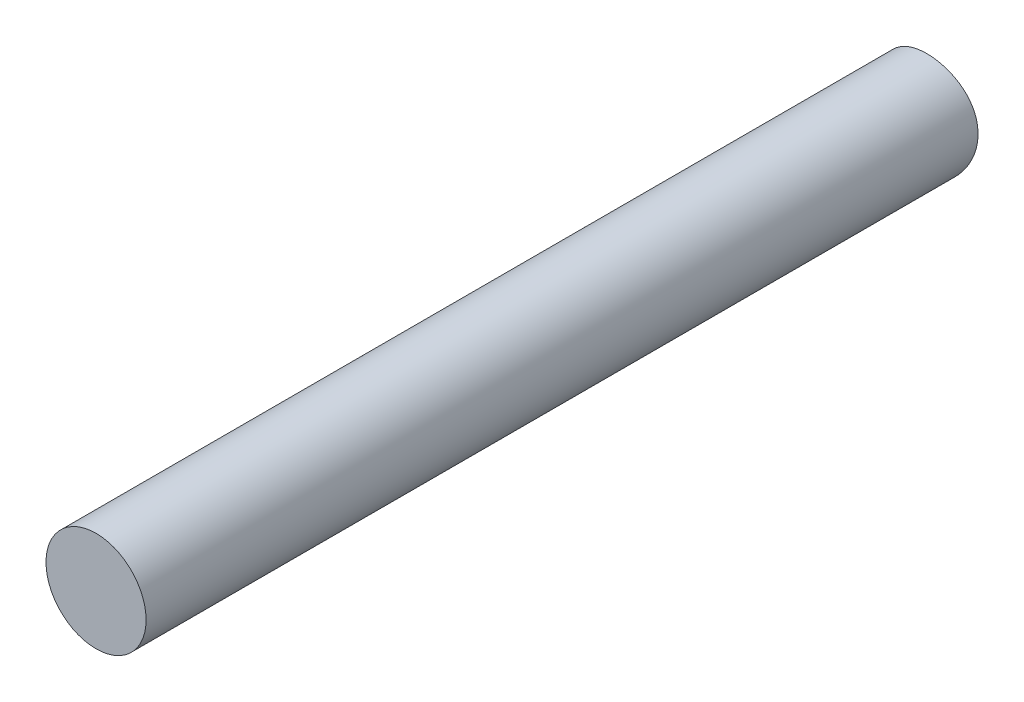
ISO-10303-21;
HEADER;
FILE_DESCRIPTION(('STEP AP214'),'2;1');
FILE_NAME('part.step','',(''),(''),'','','');
FILE_SCHEMA(('AUTOMOTIVE_DESIGN { 1 0 10303 214 1 1 1 1 }'));
ENDSEC;
DATA;
#1=APPLICATION_CONTEXT('core data for automotive mechanical design processes');
#2=APPLICATION_PROTOCOL_DEFINITION('international standard','automotive_design',2000,#1);
#3=PRODUCT_CONTEXT('',#1,'mechanical');
#4=PRODUCT('Part','Part','',(#3));
#5=PRODUCT_RELATED_PRODUCT_CATEGORY('part','',(#4));
#6=PRODUCT_DEFINITION_FORMATION('','',#4);
#7=PRODUCT_DEFINITION_CONTEXT('part definition',#1,'design');
#8=PRODUCT_DEFINITION('design','',#6,#7);
#9=PRODUCT_DEFINITION_SHAPE('','',#8);
#10=(LENGTH_UNIT() NAMED_UNIT(*) SI_UNIT(.MILLI.,.METRE.));
#11=(NAMED_UNIT(*) PLANE_ANGLE_UNIT() SI_UNIT($,.RADIAN.));
#12=(NAMED_UNIT(*) SI_UNIT($,.STERADIAN.) SOLID_ANGLE_UNIT());
#13=UNCERTAINTY_MEASURE_WITH_UNIT(LENGTH_MEASURE(1.E-05),#10,'distance_accuracy_value','');
#14=(GEOMETRIC_REPRESENTATION_CONTEXT(3) GLOBAL_UNCERTAINTY_ASSIGNED_CONTEXT((#13)) GLOBAL_UNIT_ASSIGNED_CONTEXT((#10,
#11,#12)) REPRESENTATION_CONTEXT('',''));
#15=CARTESIAN_POINT('',(0.,0.,0.));
#16=DIRECTION('',(0.,0.,1.));
#17=DIRECTION('',(1.,0.,0.));
#18=AXIS2_PLACEMENT_3D('',#15,#16,#17);
#19=CARTESIAN_POINT('',(0.,0.,100.));
#20=DIRECTION('',(0.,0.,-1.));
#21=DIRECTION('',(-1.,0.,0.));
#22=AXIS2_PLACEMENT_3D('',#19,#20,#21);
#23=CYLINDRICAL_SURFACE('',#22,6.);
#24=CARTESIAN_POINT('',(0.,0.,100.));
#25=DIRECTION('',(0.,0.,1.));
#26=DIRECTION('',(1.,0.,0.));
#27=AXIS2_PLACEMENT_3D('',#24,#25,#26);
#28=CIRCLE('',#27,6.);
#29=CARTESIAN_POINT('',(6.,0.,100.));
#30=VERTEX_POINT('',#29);
#31=EDGE_CURVE('E50',#30,#30,#28,.T.);
#32=ORIENTED_EDGE('',*,*,#31,.F.);
#33=EDGE_LOOP('',(#32));
#34=FACE_BOUND('',#33,.T.);
#35=CARTESIAN_POINT('',(-6.,0.,0.280276757339385));
#36=CARTESIAN_POINT('',(-6.00000433814422,-0.169542436823464,0.301090672741801));
#37=CARTESIAN_POINT('',(-5.99281225373469,-0.338783454049062,0.323930384703741));
#38=CARTESIAN_POINT('',(-5.96424080675467,-0.675554804479521,0.373410241821344));
#39=CARTESIAN_POINT('',(-5.94285903252469,-0.843084841973288,0.400051032398617));
#40=CARTESIAN_POINT('',(-5.88618363732555,-1.17526833145145,0.456775561347703));
#41=CARTESIAN_POINT('',(-5.85088233848071,-1.33992014340001,0.486861193350705));
#42=CARTESIAN_POINT('',(-5.76674255590366,-1.66520744441298,0.550007784068771));
#43=CARTESIAN_POINT('',(-5.71789885309411,-1.82584135895597,0.583069886555238));
#44=CARTESIAN_POINT('',(-5.60727428883879,-2.14158268441202,0.651525348386979));
#45=CARTESIAN_POINT('',(-5.54552821951553,-2.29670367116617,0.686912266255779));
#46=CARTESIAN_POINT('',(-5.40951845874265,-2.60094395794084,0.759494805219245));
#47=CARTESIAN_POINT('',(-5.33525010095297,-2.75006099487711,0.79669109687398));
#48=CARTESIAN_POINT('',(-5.09450097159228,-3.18692229402035,0.909999074527886));
#49=CARTESIAN_POINT('',(-4.90996521706956,-3.46449131877093,0.987899770542018));
#50=CARTESIAN_POINT('',(-4.49035922219369,-3.99433064164101,1.14547063548535));
#51=CARTESIAN_POINT('',(-4.25378771583463,-4.24542407571428,1.22511124521504));
#52=CARTESIAN_POINT('',(-3.86859855844462,-4.58952088785362,1.33906719975558));
#53=CARTESIAN_POINT('',(-3.73505853119191,-4.6988511718956,1.37615540973726));
#54=CARTESIAN_POINT('',(-3.45862693295408,-4.90588148844739,1.44772894200517));
#55=CARTESIAN_POINT('',(-3.3157394119906,-5.00358650682738,1.482215377807));
#56=CARTESIAN_POINT('',(-3.02208774077177,-5.18620973172814,1.54769952467595));
#57=CARTESIAN_POINT('',(-2.87135751069103,-5.27117769180277,1.57871068424229));
#58=CARTESIAN_POINT('',(-2.56255293014981,-5.42801000314345,1.63668595410391));
#59=CARTESIAN_POINT('',(-2.40448170193748,-5.49987986234954,1.66365176467914));
#60=CARTESIAN_POINT('',(-2.08209600748316,-5.62983803446521,1.71290157775466));
#61=CARTESIAN_POINT('',(-1.91778269068573,-5.68792887056739,1.7351864373375));
#62=CARTESIAN_POINT('',(-1.58414882251846,-5.7897222688261,1.77452284573884));
#63=CARTESIAN_POINT('',(-1.41482859964354,-5.83342577263946,1.79157473705231));
#64=CARTESIAN_POINT('',(-1.08302318037714,-5.90373104633304,1.8191361067674));
#65=CARTESIAN_POINT('',(-0.920752228532937,-5.93121437123719,1.82998158999873));
#66=CARTESIAN_POINT('',(-0.594240953167228,-5.97276797333171,1.84641689343823));
#67=CARTESIAN_POINT('',(-0.430000732446203,-5.98683894761823,1.85200698679085));
#68=CARTESIAN_POINT('',(-0.100865266235245,-6.00141285540473,1.8577973629866));
#69=CARTESIAN_POINT('',(0.0640298092602117,-6.0019191058663,1.85799896346978));
#70=CARTESIAN_POINT('',(0.393218938985728,-5.98936621232622,1.85301073259296));
#71=CARTESIAN_POINT('',(0.55751300561399,-5.9763073497608,1.84782101308701));
#72=CARTESIAN_POINT('',(0.876796372722684,-5.93766814464639,1.83253103900616));
#73=CARTESIAN_POINT('',(1.03186943473277,-5.91268328768023,1.82266445646681));
#74=CARTESIAN_POINT('',(1.3392854295612,-5.85071862724463,1.7983412116336));
#75=CARTESIAN_POINT('',(1.49162744909043,-5.81373488736908,1.78388304303684));
#76=CARTESIAN_POINT('',(1.79247280860804,-5.72813175111121,1.75068549776371));
#77=CARTESIAN_POINT('',(1.94097731109567,-5.67951592532669,1.7319474349283));
#78=CARTESIAN_POINT('',(2.23332027693266,-5.57105026723237,1.69056059698786));
#79=CARTESIAN_POINT('',(2.37715694274734,-5.51119616600124,1.66791033607542));
#80=CARTESIAN_POINT('',(2.66237579486242,-5.37930984539991,1.61860627448786));
#81=CARTESIAN_POINT('',(2.8036341901587,-5.30703848618208,1.59187529860821));
#82=CARTESIAN_POINT('',(3.07954741390648,-5.15184167533823,1.53531539999435));
#83=CARTESIAN_POINT('',(3.21419983278038,-5.06891237549188,1.50548535904216));
#84=CARTESIAN_POINT('',(3.60706376115113,-4.80504893662774,1.41218828048038));
#85=CARTESIAN_POINT('',(3.85437972268896,-4.60894721655561,1.34487898393219));
#86=CARTESIAN_POINT('',(4.32914093209324,-4.16774857690459,1.20033941018718));
#87=CARTESIAN_POINT('',(4.55431961654629,-3.92032766104424,1.12275035856573));
#88=CARTESIAN_POINT('',(4.85888478528958,-3.52407428617518,1.00613529102219));
#89=CARTESIAN_POINT('',(4.95492354809921,-3.38770742385942,0.967200009126593));
#90=CARTESIAN_POINT('',(5.13538258686811,-3.10734624215031,0.889939538432742));
#91=CARTESIAN_POINT('',(5.2198067507564,-2.96335449761056,0.851614149293573));
#92=CARTESIAN_POINT('',(5.37945327451046,-2.66298779363307,0.774823920508624));
#93=CARTESIAN_POINT('',(5.45420558711728,-2.50635033859853,0.736408852187022));
#94=CARTESIAN_POINT('',(5.5899871467491,-2.1868156359808,0.661701601559556));
#95=CARTESIAN_POINT('',(5.65102160364427,-2.02392079249089,0.625408617200339));
#96=CARTESIAN_POINT('',(5.75886604920067,-1.6928605780239,0.555586036557527));
#97=CARTESIAN_POINT('',(5.80567244222901,-1.52469388660115,0.522057140355683));
#98=CARTESIAN_POINT('',(5.88453262698554,-1.18438445271026,0.45837615502169));
#99=CARTESIAN_POINT('',(5.91659300652698,-1.01224352191034,0.428222562529869));
#100=CARTESIAN_POINT('',(5.96493609200087,-0.669805200429445,0.37251581947717));
#101=CARTESIAN_POINT('',(5.98161503928068,-0.499580177070491,0.346861794554006));
#102=CARTESIAN_POINT('',(6.0003629864536,-0.157840995317267,0.299555830354576));
#103=CARTESIAN_POINT('',(6.00243806131312,0.0136725973271267,0.277902230618986));
#104=CARTESIAN_POINT('',(5.99184437845175,0.356717406909162,0.238805637488344));
#105=CARTESIAN_POINT('',(5.97917642700376,0.528248622370086,0.221362413897437));
#106=CARTESIAN_POINT('',(5.93908702399121,0.869963204530905,0.190770568406816));
#107=CARTESIAN_POINT('',(5.91166607880047,1.04014661728863,0.177621799131459));
#108=CARTESIAN_POINT('',(5.84383223446716,1.36989980027028,0.156078165377811));
#109=CARTESIAN_POINT('',(5.80408511001975,1.52959433115557,0.147490139998867));
#110=CARTESIAN_POINT('',(5.71153817835465,1.84537534018519,0.134001535099678));
#111=CARTESIAN_POINT('',(5.65873393626937,2.00146057268857,0.129102210743346));
#112=CARTESIAN_POINT('',(5.54046283014588,2.30875888693575,0.122732655256084));
#113=CARTESIAN_POINT('',(5.47500077167468,2.45997379237349,0.121261125513093));
#114=CARTESIAN_POINT('',(5.33183802391978,2.75656100095483,0.121390419763651));
#115=CARTESIAN_POINT('',(5.25413275817303,2.90193109372346,0.122992395134144));
#116=CARTESIAN_POINT('',(5.0875704888405,3.18487225148061,0.128828638829393));
#117=CARTESIAN_POINT('',(4.99878500924933,3.32248578312303,0.133046657567612));
#118=CARTESIAN_POINT('',(4.81027615673651,3.58998982593281,0.143634824479199));
#119=CARTESIAN_POINT('',(4.71054882698436,3.71987751689591,0.150005752939164));
#120=CARTESIAN_POINT('',(4.50089352590325,3.9709826288297,0.164396885849241));
#121=CARTESIAN_POINT('',(4.3909682550438,4.09220233016002,0.172416654357889));
#122=CARTESIAN_POINT('',(4.16159042398419,4.32526403723157,0.189594259115872));
#123=CARTESIAN_POINT('',(4.04213430954737,4.43710251233664,0.198752520648626));
#124=CARTESIAN_POINT('',(3.79163800302143,4.65311342270557,0.217909736194216));
#125=CARTESIAN_POINT('',(3.66039310943233,4.75704728378946,0.227923281923372));
#126=CARTESIAN_POINT('',(3.38963654589286,4.95362117226279,0.248067906108926));
#127=CARTESIAN_POINT('',(3.25012181036181,5.0462569721284,0.258199027016344));
#128=CARTESIAN_POINT('',(2.96386413844739,5.21952982827439,0.278066600683374));
#129=CARTESIAN_POINT('',(2.81712353620324,5.30017072580837,0.287803179061602));
#130=CARTESIAN_POINT('',(2.51731862932983,5.44895606599912,0.30642755371594));
#131=CARTESIAN_POINT('',(2.3642520263526,5.5170959170218,0.315315037547523));
#132=CARTESIAN_POINT('',(2.0514584916419,5.64092823579792,0.331907885340149));
#133=CARTESIAN_POINT('',(1.89168311213119,5.69649996223633,0.339601576574009));
#134=CARTESIAN_POINT('',(1.56794362923618,5.7939736054814,0.353359005304725));
#135=CARTESIAN_POINT('',(1.4039794624246,5.83587531516203,0.359422718104146));
#136=CARTESIAN_POINT('',(1.07305102150307,5.90568846407941,0.369650302851655));
#137=CARTESIAN_POINT('',(0.906086941440829,5.93360080486,0.373814297225402));
#138=CARTESIAN_POINT('',(0.570359900826324,5.9752238525935,0.380060068763574));
#139=CARTESIAN_POINT('',(0.401596958880523,5.98893470629524,0.382141867444033));
#140=CARTESIAN_POINT('',(0.0651799915694214,6.00198361043008,0.384122711897834));
#141=CARTESIAN_POINT('',(-0.102468450339817,6.00146274208793,0.384043183279597));
#142=CARTESIAN_POINT('',(-0.437115994329624,5.98639981247515,0.381757635562417));
#143=CARTESIAN_POINT('',(-0.604115111324833,5.97185807518937,0.379551665599861));
#144=CARTESIAN_POINT('',(-0.936302847415987,5.92886091626205,0.373107087862801));
#145=CARTESIAN_POINT('',(-1.10149113167516,5.90040296433919,0.368868110444444));
#146=CARTESIAN_POINT('',(-1.42879393185877,5.82979982592548,0.358541897236908));
#147=CARTESIAN_POINT('',(-1.59090953562284,5.78765958301366,0.352455329056482));
#148=CARTESIAN_POINT('',(-1.91063247273256,5.6901103964268,0.338713983824281));
#149=CARTESIAN_POINT('',(-2.06824905469164,5.63473125633113,0.331062734717317));
#150=CARTESIAN_POINT('',(-2.37820539617506,5.511077050818,0.314524780020238));
#151=CARTESIAN_POINT('',(-2.53054703549423,5.44280663652844,0.305638520322057));
#152=CARTESIAN_POINT('',(-2.82903803653481,5.2938058581615,0.287027401427906));
#153=CARTESIAN_POINT('',(-2.97518470074955,5.21307013586903,0.277302182402135));
#154=CARTESIAN_POINT('',(-3.26017439442325,5.03974884026677,0.257478381171891));
#155=CARTESIAN_POINT('',(-3.39902000560698,4.94716749598883,0.247379933125318));
#156=CARTESIAN_POINT('',(-3.67000155533048,4.74968444088807,0.22719742620236));
#157=CARTESIAN_POINT('',(-3.80204746815471,4.64465902112525,0.217114733467242));
#158=CARTESIAN_POINT('',(-4.05681002233018,4.42387773779974,0.197628961999341));
#159=CARTESIAN_POINT('',(-4.17953008548311,4.30812584488683,0.188225634059904));
#160=CARTESIAN_POINT('',(-4.41489248572461,4.06659210104555,0.170654993647482));
#161=CARTESIAN_POINT('',(-4.52752979523626,3.94080530486863,0.162488296409132));
#162=CARTESIAN_POINT('',(-4.74181045287892,3.68017438078714,0.147964773772991));
#163=CARTESIAN_POINT('',(-4.84345806173297,3.54533379615599,0.141607245386224));
#164=CARTESIAN_POINT('',(-5.03496402646699,3.26765211928218,0.131249393101058));
#165=CARTESIAN_POINT('',(-5.12483500805116,3.12481983337499,0.127246528432359));
#166=CARTESIAN_POINT('',(-5.29221711842816,2.83211100363805,0.122092866548573));
#167=CARTESIAN_POINT('',(-5.36973300936962,2.68223720287196,0.120940967957244));
#168=CARTESIAN_POINT('',(-5.51183199060133,2.37657127022087,0.121931074035991));
#169=CARTESIAN_POINT('',(-5.57642158143954,2.2207821602398,0.124071418331787));
#170=CARTESIAN_POINT('',(-5.69222663206902,1.9044532795943,0.131998968286458));
#171=CARTESIAN_POINT('',(-5.7434441570171,1.74391424676773,0.13778561034618));
#172=CARTESIAN_POINT('',(-5.85828138347763,1.32361132208902,0.157846983495093));
#173=CARTESIAN_POINT('',(-5.91145969559777,1.06105679907075,0.17511291689229));
#174=CARTESIAN_POINT('',(-5.9823155352341,0.532088127912433,0.220020060296942));
#175=CARTESIAN_POINT('',(-5.99999320210251,0.265673994926823,0.247661229577527));
#176=CARTESIAN_POINT('',(-6.,0.,0.280276757339385));
#177=B_SPLINE_CURVE_WITH_KNOTS('',3,(#35,#36,#37,#38,#39,#40,#41,#42,#43,#44,#45,#46,#47,#48,
#49,#50,#51,#52,#53,#54,#55,#56,#57,#58,#59,#60,#61,#62,#63,#64,#65,#66,#67,#68,#69,#70,#71,#72,
#73,#74,#75,#76,#77,#78,#79,#80,#81,#82,#83,#84,#85,#86,#87,#88,#89,#90,#91,#92,#93,#94,#95,#96,
#97,#98,#99,#100,#101,#102,#103,#104,#105,#106,#107,#108,#109,#110,#111,#112,#113,#114,#115,
#116,#117,#118,#119,#120,#121,#122,#123,#124,#125,#126,#127,#128,#129,#130,#131,#132,#133,#134,
#135,#136,#137,#138,#139,#140,#141,#142,#143,#144,#145,#146,#147,#148,#149,#150,#151,#152,#153,
#154,#155,#156,#157,#158,#159,#160,#161,#162,#163,#164,#165,#166,#167,#168,#169,#170,#171,#172,
#173,#174,#175,#176),.UNSPECIFIED.,.T.,.F.,(4,2,2,2,2,2,2,2,2,2,2,2,2,2,2,2,2,2,2,2,2,2,2,2,2,2,
2,2,2,2,2,2,2,2,2,2,2,2,2,2,2,2,2,2,2,2,2,2,2,2,2,2,2,2,2,2,2,2,2,2,2,2,2,2,2,2,2,2,2,2,4),(0.,
0.512195721927482,1.02447851821274,1.53704428092789,2.04980785547018,2.56120617021664,
3.07279547673015,4.09496391857437,5.15178971163195,5.68083128697237,6.20964514159871,
6.73633626985003,7.26280540326565,7.78917805594322,8.31551625046081,8.80970442479319,
9.30386691269211,9.79790856267567,10.2919399629518,10.7635389502495,11.235292809088,
11.7069020432093,12.1786907844728,12.6608683022867,13.1432204097311,14.1072692391336,
15.1326766934301,15.6460384241281,16.1592278892272,16.6918682604648,17.2243059984298,
17.7568781792893,18.2892122007245,18.8074148886613,19.3254020002085,19.8433607851874,
20.3613017931621,20.8550799882775,21.3490261267447,21.8427851044042,22.3367290870297,
22.8276352407493,23.3187195064672,23.8096740996196,24.3008126427954,24.8033656932413,
25.3061062164657,25.8086853935767,26.3114488000403,26.8188544345151,27.3262677567671,
27.8336483745993,28.3410237494411,28.8433712767872,29.3457071965006,29.8481344861793,
30.3503804443713,30.8515062142743,31.3524515239816,31.853612767726,32.3545955874288,
32.8610593829653,33.3673364425808,33.8738645577247,34.3801955815796,34.8859792483296,
35.3915674918057,35.8969008359479,36.4021560911285,37.2047729481872,38.007386654693),.UNSPECIFIED.);
#178=CARTESIAN_POINT('',(-6.,0.,0.280276757339385));
#179=VERTEX_POINT('',#178);
#180=EDGE_CURVE('E10',#179,#179,#177,.T.);
#181=ORIENTED_EDGE('',*,*,#180,.T.);
#182=EDGE_LOOP('',(#181));
#183=FACE_BOUND('',#182,.T.);
#184=ADVANCED_FACE('F39',(#34,#183),#23,.T.);
#185=CARTESIAN_POINT('',(0.,0.,100.));
#186=DIRECTION('',(0.,0.,1.));
#187=DIRECTION('',(1.,0.,0.));
#188=AXIS2_PLACEMENT_3D('',#185,#186,#187);
#189=PLANE('',#188);
#190=ORIENTED_EDGE('',*,*,#31,.T.);
#191=EDGE_LOOP('',(#190));
#192=FACE_BOUND('',#191,.T.);
#193=ADVANCED_FACE('F56',(#192),#189,.T.);
#194=CARTESIAN_POINT('',(0.,-20.5536733261491,-18.5210130213135));
#195=DIRECTION('',(0.,0.992546151641323,-0.121869343405137));
#196=DIRECTION('',(0.,0.121869343405137,0.992546151641323));
#197=AXIS2_PLACEMENT_3D('',#194,#195,#196);
#198=CYLINDRICAL_SURFACE('',#197,22.);
#199=ORIENTED_EDGE('',*,*,#180,.F.);
#200=EDGE_LOOP('',(#199));
#201=FACE_BOUND('',#200,.T.);
#202=ADVANCED_FACE('F63',(#201),#198,.F.);
#203=CLOSED_SHELL('',(#184,#193,#202));
#204=MANIFOLD_SOLID_BREP('B2',#203);
#205=ADVANCED_BREP_SHAPE_REPRESENTATION('',(#18,#204),#14);
#206=SHAPE_DEFINITION_REPRESENTATION(#9,#205);
ENDSEC;
END-ISO-10303-21;
